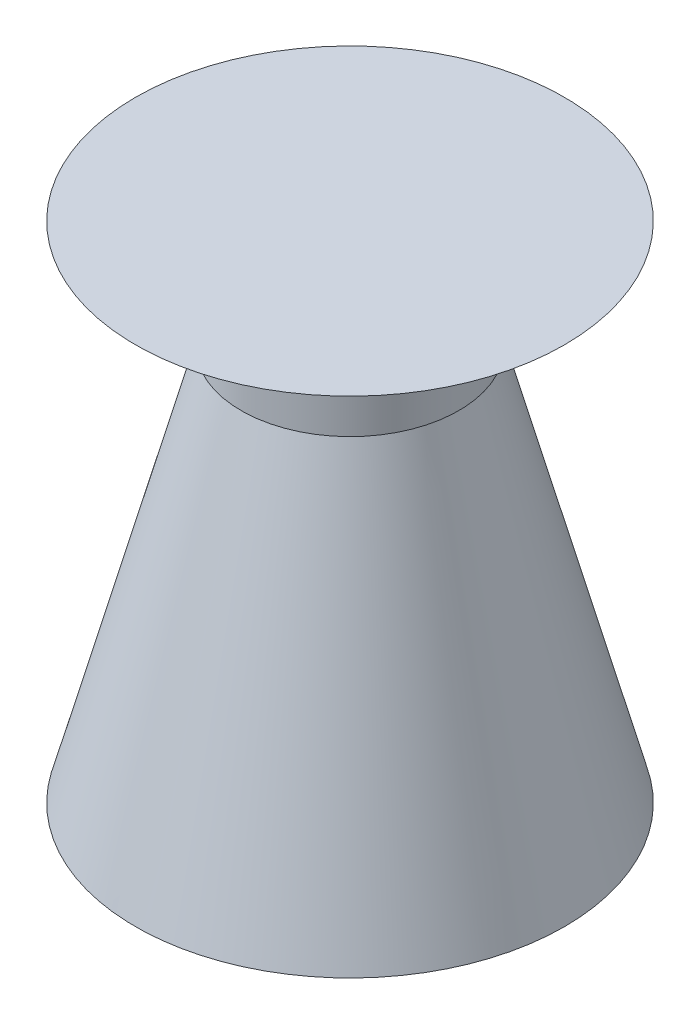
ISO-10303-21;
HEADER;
FILE_DESCRIPTION(('STEP AP214'),'2;1');
FILE_NAME('part.step','',(''),(''),'','','');
FILE_SCHEMA(('AUTOMOTIVE_DESIGN { 1 0 10303 214 1 1 1 1 }'));
ENDSEC;
DATA;
#1=APPLICATION_CONTEXT('core data for automotive mechanical design processes');
#2=APPLICATION_PROTOCOL_DEFINITION('international standard','automotive_design',2000,#1);
#3=PRODUCT_CONTEXT('',#1,'mechanical');
#4=PRODUCT('Part','Part','',(#3));
#5=PRODUCT_RELATED_PRODUCT_CATEGORY('part','',(#4));
#6=PRODUCT_DEFINITION_FORMATION('','',#4);
#7=PRODUCT_DEFINITION_CONTEXT('part definition',#1,'design');
#8=PRODUCT_DEFINITION('design','',#6,#7);
#9=PRODUCT_DEFINITION_SHAPE('','',#8);
#10=(LENGTH_UNIT() NAMED_UNIT(*) SI_UNIT(.MILLI.,.METRE.));
#11=(NAMED_UNIT(*) PLANE_ANGLE_UNIT() SI_UNIT($,.RADIAN.));
#12=(NAMED_UNIT(*) SI_UNIT($,.STERADIAN.) SOLID_ANGLE_UNIT());
#13=UNCERTAINTY_MEASURE_WITH_UNIT(LENGTH_MEASURE(1.E-05),#10,'distance_accuracy_value','');
#14=(GEOMETRIC_REPRESENTATION_CONTEXT(3) GLOBAL_UNCERTAINTY_ASSIGNED_CONTEXT((#13)) GLOBAL_UNIT_ASSIGNED_CONTEXT((#10,
#11,#12)) REPRESENTATION_CONTEXT('',''));
#15=CARTESIAN_POINT('',(0.,0.,0.));
#16=DIRECTION('',(0.,0.,1.));
#17=DIRECTION('',(1.,0.,0.));
#18=AXIS2_PLACEMENT_3D('',#15,#16,#17);
#19=CARTESIAN_POINT('',(0.,32.8219125536568,0.));
#20=DIRECTION('',(0.,1.,0.));
#21=DIRECTION('',(-1.,0.,0.));
#22=AXIS2_PLACEMENT_3D('',#19,#20,#21);
#23=CYLINDRICAL_SURFACE('',#22,14.18082);
#24=CARTESIAN_POINT('',(0.,24.8780462768284,0.));
#25=DIRECTION('',(0.,1.,0.));
#26=DIRECTION('',(-1.,0.,0.));
#27=AXIS2_PLACEMENT_3D('',#24,#25,#26);
#28=CIRCLE('',#27,14.18082);
#29=CARTESIAN_POINT('',(-14.18082,24.8780462768284,0.));
#30=VERTEX_POINT('',#29);
#31=EDGE_CURVE('E10',#30,#30,#28,.T.);
#32=ORIENTED_EDGE('',*,*,#31,.F.);
#33=EDGE_LOOP('',(#32));
#34=FACE_BOUND('',#33,.T.);
#35=CARTESIAN_POINT('',(0.,18.5280462768284,0.));
#36=DIRECTION('',(0.,1.,0.));
#37=DIRECTION('',(-1.,0.,0.));
#38=AXIS2_PLACEMENT_3D('',#35,#36,#37);
#39=CIRCLE('',#38,14.18082);
#40=CARTESIAN_POINT('',(-14.18082,18.5280462768284,0.));
#41=VERTEX_POINT('',#40);
#42=EDGE_CURVE('E49',#41,#41,#39,.T.);
#43=ORIENTED_EDGE('',*,*,#42,.T.);
#44=EDGE_LOOP('',(#43));
#45=FACE_BOUND('',#44,.T.);
#46=ADVANCED_FACE('F35',(#34,#45),#23,.T.);
#47=CARTESIAN_POINT('',(0.,24.8780462768284,0.));
#48=DIRECTION('',(0.,1.,0.));
#49=DIRECTION('',(-1.,0.,0.));
#50=AXIS2_PLACEMENT_3D('',#47,#48,#49);
#51=CONICAL_SURFACE('',#50,14.18082,1.0471975511966);
#52=CARTESIAN_POINT('',(0.,32.8219125536568,0.));
#53=DIRECTION('',(0.,1.,0.));
#54=DIRECTION('',(-1.,0.,0.));
#55=AXIS2_PLACEMENT_3D('',#52,#53,#54);
#56=CIRCLE('',#55,27.94);
#57=CARTESIAN_POINT('',(-27.94,32.8219125536568,0.));
#58=VERTEX_POINT('',#57);
#59=EDGE_CURVE('E41',#58,#58,#56,.T.);
#60=ORIENTED_EDGE('',*,*,#59,.F.);
#61=EDGE_LOOP('',(#60));
#62=FACE_BOUND('',#61,.T.);
#63=ORIENTED_EDGE('',*,*,#31,.T.);
#64=EDGE_LOOP('',(#63));
#65=FACE_BOUND('',#64,.T.);
#66=ADVANCED_FACE('F69',(#62,#65),#51,.T.);
#67=CARTESIAN_POINT('',(0.,32.8219125536568,0.));
#68=DIRECTION('',(0.,-1.,0.));
#69=DIRECTION('',(1.,0.,0.));
#70=AXIS2_PLACEMENT_3D('',#67,#68,#69);
#71=PLANE('',#70);
#72=ORIENTED_EDGE('',*,*,#59,.T.);
#73=EDGE_LOOP('',(#72));
#74=FACE_BOUND('',#73,.T.);
#75=ADVANCED_FACE('F64',(#74),#71,.F.);
#76=CARTESIAN_POINT('',(0.,-32.8219125536568,0.));
#77=DIRECTION('',(0.,1.,0.));
#78=DIRECTION('',(-1.,0.,0.));
#79=AXIS2_PLACEMENT_3D('',#76,#77,#78);
#80=PLANE('',#79);
#81=CARTESIAN_POINT('',(0.,-32.8219125536568,0.));
#82=DIRECTION('',(0.,1.,0.));
#83=DIRECTION('',(-1.,0.,0.));
#84=AXIS2_PLACEMENT_3D('',#81,#82,#83);
#85=CIRCLE('',#84,27.94);
#86=CARTESIAN_POINT('',(-27.94,-32.8219125536568,0.));
#87=VERTEX_POINT('',#86);
#88=EDGE_CURVE('E45',#87,#87,#85,.T.);
#89=ORIENTED_EDGE('',*,*,#88,.F.);
#90=EDGE_LOOP('',(#89));
#91=FACE_BOUND('',#90,.T.);
#92=ADVANCED_FACE('F59',(#91),#80,.F.);
#93=CARTESIAN_POINT('',(0.,-32.8219125536568,0.));
#94=DIRECTION('',(0.,-1.,0.));
#95=DIRECTION('',(1.,0.,0.));
#96=AXIS2_PLACEMENT_3D('',#93,#94,#95);
#97=CONICAL_SURFACE('',#96,27.94,0.261799387799151);
#98=ORIENTED_EDGE('',*,*,#42,.F.);
#99=EDGE_LOOP('',(#98));
#100=FACE_BOUND('',#99,.T.);
#101=ORIENTED_EDGE('',*,*,#88,.T.);
#102=EDGE_LOOP('',(#101));
#103=FACE_BOUND('',#102,.T.);
#104=ADVANCED_FACE('F56',(#100,#103),#97,.T.);
#105=CLOSED_SHELL('',(#46,#66,#75,#92,#104));
#106=MANIFOLD_SOLID_BREP('B2',#105);
#107=ADVANCED_BREP_SHAPE_REPRESENTATION('',(#18,#106),#14);
#108=SHAPE_DEFINITION_REPRESENTATION(#9,#107);
ENDSEC;
END-ISO-10303-21;
